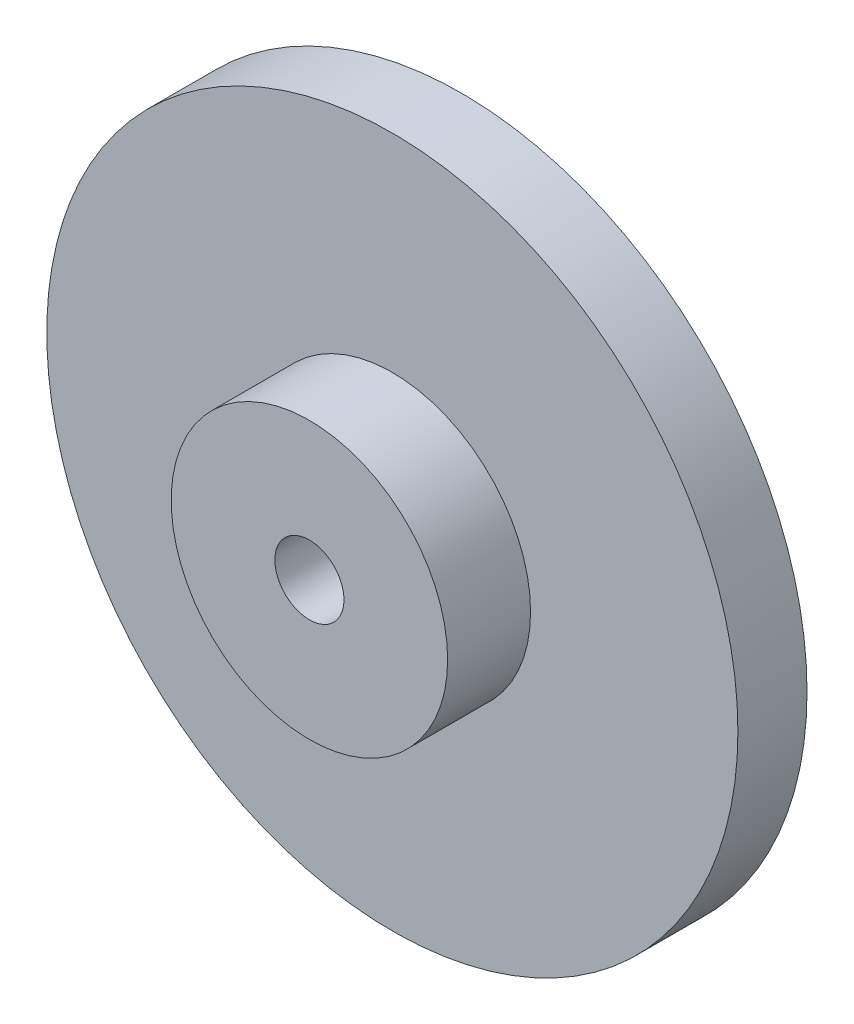
ISO-10303-21;
HEADER;
FILE_DESCRIPTION(('STEP AP214'),'2;1');
FILE_NAME('part.step','',(''),(''),'','','');
FILE_SCHEMA(('AUTOMOTIVE_DESIGN { 1 0 10303 214 1 1 1 1 }'));
ENDSEC;
DATA;
#1=APPLICATION_CONTEXT('core data for automotive mechanical design processes');
#2=APPLICATION_PROTOCOL_DEFINITION('international standard','automotive_design',2000,#1);
#3=PRODUCT_CONTEXT('',#1,'mechanical');
#4=PRODUCT('Part','Part','',(#3));
#5=PRODUCT_RELATED_PRODUCT_CATEGORY('part','',(#4));
#6=PRODUCT_DEFINITION_FORMATION('','',#4);
#7=PRODUCT_DEFINITION_CONTEXT('part definition',#1,'design');
#8=PRODUCT_DEFINITION('design','',#6,#7);
#9=PRODUCT_DEFINITION_SHAPE('','',#8);
#10=(LENGTH_UNIT() NAMED_UNIT(*) SI_UNIT(.MILLI.,.METRE.));
#11=(NAMED_UNIT(*) PLANE_ANGLE_UNIT() SI_UNIT($,.RADIAN.));
#12=(NAMED_UNIT(*) SI_UNIT($,.STERADIAN.) SOLID_ANGLE_UNIT());
#13=UNCERTAINTY_MEASURE_WITH_UNIT(LENGTH_MEASURE(1.E-05),#10,'distance_accuracy_value','');
#14=(GEOMETRIC_REPRESENTATION_CONTEXT(3) GLOBAL_UNCERTAINTY_ASSIGNED_CONTEXT((#13)) GLOBAL_UNIT_ASSIGNED_CONTEXT((#10,
#11,#12)) REPRESENTATION_CONTEXT('',''));
#15=CARTESIAN_POINT('',(0.,0.,0.));
#16=DIRECTION('',(0.,0.,1.));
#17=DIRECTION('',(1.,0.,0.));
#18=AXIS2_PLACEMENT_3D('',#15,#16,#17);
#19=CARTESIAN_POINT('',(0.,0.,5.));
#20=DIRECTION('',(0.,0.,-1.));
#21=DIRECTION('',(-1.,0.,0.));
#22=AXIS2_PLACEMENT_3D('',#19,#20,#21);
#23=CYLINDRICAL_SURFACE('',#22,25.);
#24=CARTESIAN_POINT('',(0.,0.,5.));
#25=DIRECTION('',(0.,0.,1.));
#26=DIRECTION('',(1.,0.,0.));
#27=AXIS2_PLACEMENT_3D('',#24,#25,#26);
#28=CIRCLE('',#27,25.);
#29=CARTESIAN_POINT('',(25.,0.,5.));
#30=VERTEX_POINT('',#29);
#31=EDGE_CURVE('E37',#30,#30,#28,.T.);
#32=ORIENTED_EDGE('',*,*,#31,.F.);
#33=EDGE_LOOP('',(#32));
#34=FACE_BOUND('',#33,.T.);
#35=CARTESIAN_POINT('',(0.,0.,0.));
#36=DIRECTION('',(0.,0.,1.));
#37=DIRECTION('',(1.,0.,0.));
#38=AXIS2_PLACEMENT_3D('',#35,#36,#37);
#39=CIRCLE('',#38,25.);
#40=CARTESIAN_POINT('',(25.,0.,0.));
#41=VERTEX_POINT('',#40);
#42=EDGE_CURVE('E33',#41,#41,#39,.T.);
#43=ORIENTED_EDGE('',*,*,#42,.T.);
#44=EDGE_LOOP('',(#43));
#45=FACE_BOUND('',#44,.T.);
#46=ADVANCED_FACE('F30',(#34,#45),#23,.T.);
#47=CARTESIAN_POINT('',(0.,0.,5.));
#48=DIRECTION('',(0.,0.,1.));
#49=DIRECTION('',(1.,0.,0.));
#50=AXIS2_PLACEMENT_3D('',#47,#48,#49);
#51=PLANE('',#50);
#52=CARTESIAN_POINT('',(0.,0.,5.));
#53=DIRECTION('',(0.,0.,1.));
#54=DIRECTION('',(1.,0.,0.));
#55=AXIS2_PLACEMENT_3D('',#52,#53,#54);
#56=CIRCLE('',#55,10.);
#57=CARTESIAN_POINT('',(10.,0.,5.));
#58=VERTEX_POINT('',#57);
#59=EDGE_CURVE('E10',#58,#58,#56,.T.);
#60=ORIENTED_EDGE('',*,*,#59,.F.);
#61=EDGE_LOOP('',(#60));
#62=FACE_BOUND('',#61,.T.);
#63=ORIENTED_EDGE('',*,*,#31,.T.);
#64=EDGE_LOOP('',(#63));
#65=FACE_BOUND('',#64,.T.);
#66=ADVANCED_FACE('F74',(#62,#65),#51,.T.);
#67=CARTESIAN_POINT('',(0.,0.,0.));
#68=DIRECTION('',(0.,0.,1.));
#69=DIRECTION('',(1.,0.,0.));
#70=AXIS2_PLACEMENT_3D('',#67,#68,#69);
#71=PLANE('',#70);
#72=CARTESIAN_POINT('',(0.,0.,0.));
#73=DIRECTION('',(0.,0.,1.));
#74=DIRECTION('',(1.,0.,0.));
#75=AXIS2_PLACEMENT_3D('',#72,#73,#74);
#76=CIRCLE('',#75,2.5);
#77=CARTESIAN_POINT('',(2.5,0.,0.));
#78=VERTEX_POINT('',#77);
#79=EDGE_CURVE('E46',#78,#78,#76,.T.);
#80=ORIENTED_EDGE('',*,*,#79,.T.);
#81=EDGE_LOOP('',(#80));
#82=FACE_BOUND('',#81,.T.);
#83=ORIENTED_EDGE('',*,*,#42,.F.);
#84=EDGE_LOOP('',(#83));
#85=FACE_BOUND('',#84,.T.);
#86=ADVANCED_FACE('F53',(#82,#85),#71,.F.);
#87=CARTESIAN_POINT('',(0.,0.,11.));
#88=DIRECTION('',(0.,0.,-1.));
#89=DIRECTION('',(-1.,0.,0.));
#90=AXIS2_PLACEMENT_3D('',#87,#88,#89);
#91=CYLINDRICAL_SURFACE('',#90,10.);
#92=CARTESIAN_POINT('',(0.,0.,11.));
#93=DIRECTION('',(0.,0.,1.));
#94=DIRECTION('',(1.,0.,0.));
#95=AXIS2_PLACEMENT_3D('',#92,#93,#94);
#96=CIRCLE('',#95,10.);
#97=CARTESIAN_POINT('',(10.,0.,11.));
#98=VERTEX_POINT('',#97);
#99=EDGE_CURVE('E43',#98,#98,#96,.T.);
#100=ORIENTED_EDGE('',*,*,#99,.F.);
#101=EDGE_LOOP('',(#100));
#102=FACE_BOUND('',#101,.T.);
#103=ORIENTED_EDGE('',*,*,#59,.T.);
#104=EDGE_LOOP('',(#103));
#105=FACE_BOUND('',#104,.T.);
#106=ADVANCED_FACE('F65',(#102,#105),#91,.T.);
#107=CARTESIAN_POINT('',(0.,0.,11.));
#108=DIRECTION('',(0.,0.,1.));
#109=DIRECTION('',(1.,0.,0.));
#110=AXIS2_PLACEMENT_3D('',#107,#108,#109);
#111=PLANE('',#110);
#112=CARTESIAN_POINT('',(0.,0.,11.));
#113=DIRECTION('',(0.,0.,1.));
#114=DIRECTION('',(1.,0.,0.));
#115=AXIS2_PLACEMENT_3D('',#112,#113,#114);
#116=CIRCLE('',#115,2.5);
#117=CARTESIAN_POINT('',(2.5,0.,11.));
#118=VERTEX_POINT('',#117);
#119=EDGE_CURVE('E47',#118,#118,#116,.T.);
#120=ORIENTED_EDGE('',*,*,#119,.F.);
#121=EDGE_LOOP('',(#120));
#122=FACE_BOUND('',#121,.T.);
#123=ORIENTED_EDGE('',*,*,#99,.T.);
#124=EDGE_LOOP('',(#123));
#125=FACE_BOUND('',#124,.T.);
#126=ADVANCED_FACE('F59',(#122,#125),#111,.T.);
#127=CARTESIAN_POINT('',(0.,0.,0.));
#128=DIRECTION('',(0.,0.,1.));
#129=DIRECTION('',(1.,0.,0.));
#130=AXIS2_PLACEMENT_3D('',#127,#128,#129);
#131=CYLINDRICAL_SURFACE('',#130,2.5);
#132=ORIENTED_EDGE('',*,*,#79,.F.);
#133=EDGE_LOOP('',(#132));
#134=FACE_BOUND('',#133,.T.);
#135=ORIENTED_EDGE('',*,*,#119,.T.);
#136=EDGE_LOOP('',(#135));
#137=FACE_BOUND('',#136,.T.);
#138=ADVANCED_FACE('F56',(#134,#137),#131,.F.);
#139=CLOSED_SHELL('',(#46,#66,#86,#106,#126,#138));
#140=MANIFOLD_SOLID_BREP('B2',#139);
#141=ADVANCED_BREP_SHAPE_REPRESENTATION('',(#18,#140),#14);
#142=SHAPE_DEFINITION_REPRESENTATION(#9,#141);
ENDSEC;
END-ISO-10303-21;
